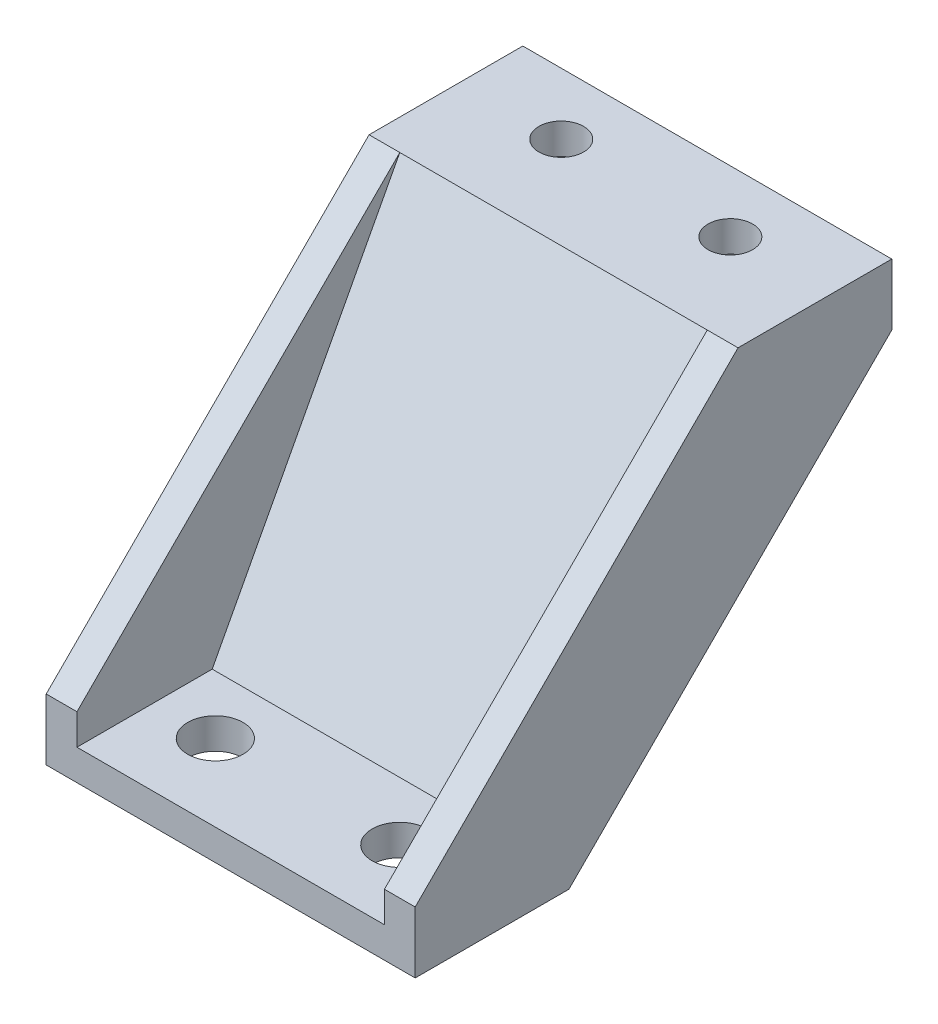
ISO-10303-21;
HEADER;
FILE_DESCRIPTION(('STEP AP214'),'2;1');
FILE_NAME('part.step','',(''),(''),'','','');
FILE_SCHEMA(('AUTOMOTIVE_DESIGN { 1 0 10303 214 1 1 1 1 }'));
ENDSEC;
DATA;
#1=APPLICATION_CONTEXT('core data for automotive mechanical design processes');
#2=APPLICATION_PROTOCOL_DEFINITION('international standard','automotive_design',2000,#1);
#3=PRODUCT_CONTEXT('',#1,'mechanical');
#4=PRODUCT('Part','Part','',(#3));
#5=PRODUCT_RELATED_PRODUCT_CATEGORY('part','',(#4));
#6=PRODUCT_DEFINITION_FORMATION('','',#4);
#7=PRODUCT_DEFINITION_CONTEXT('part definition',#1,'design');
#8=PRODUCT_DEFINITION('design','',#6,#7);
#9=PRODUCT_DEFINITION_SHAPE('','',#8);
#10=(LENGTH_UNIT() NAMED_UNIT(*) SI_UNIT(.MILLI.,.METRE.));
#11=(NAMED_UNIT(*) PLANE_ANGLE_UNIT() SI_UNIT($,.RADIAN.));
#12=(NAMED_UNIT(*) SI_UNIT($,.STERADIAN.) SOLID_ANGLE_UNIT());
#13=UNCERTAINTY_MEASURE_WITH_UNIT(LENGTH_MEASURE(1.E-05),#10,'distance_accuracy_value','');
#14=(GEOMETRIC_REPRESENTATION_CONTEXT(3) GLOBAL_UNCERTAINTY_ASSIGNED_CONTEXT((#13)) GLOBAL_UNIT_ASSIGNED_CONTEXT((#10,
#11,#12)) REPRESENTATION_CONTEXT('',''));
#15=CARTESIAN_POINT('',(0.,0.,0.));
#16=DIRECTION('',(0.,0.,1.));
#17=DIRECTION('',(1.,0.,0.));
#18=AXIS2_PLACEMENT_3D('',#15,#16,#17);
#19=CARTESIAN_POINT('',(2.,0.,0.));
#20=DIRECTION('',(1.,0.,0.));
#21=DIRECTION('',(0.,0.,-1.));
#22=AXIS2_PLACEMENT_3D('',#19,#20,#21);
#23=PLANE('',#22);
#24=DIRECTION('',(0.,0.,1.));
#25=VECTOR('',#24,1.);
#26=CARTESIAN_POINT('',(2.,2.,0.));
#27=LINE('',#26,#25);
#28=CARTESIAN_POINT('',(2.,2.,-8.79706096712944));
#29=VERTEX_POINT('',#28);
#30=CARTESIAN_POINT('',(2.,2.,0.));
#31=VERTEX_POINT('',#30);
#32=EDGE_CURVE('E51',#29,#31,#27,.T.);
#33=ORIENTED_EDGE('',*,*,#32,.F.);
#34=DIRECTION('',(0.,-0.883367189804038,0.468681563513774));
#35=VECTOR('',#34,1.);
#36=CARTESIAN_POINT('',(2.,2.,-8.79706096712944));
#37=LINE('',#36,#35);
#38=CARTESIAN_POINT('',(2.,25.,-20.9999999999999));
#39=VERTEX_POINT('',#38);
#40=EDGE_CURVE('E217',#39,#29,#37,.T.);
#41=ORIENTED_EDGE('',*,*,#40,.F.);
#42=DIRECTION('',(0.,-0.707106781186549,0.707106781186546));
#43=VECTOR('',#42,1.);
#44=CARTESIAN_POINT('',(2.,25.,-20.9999999999999));
#45=LINE('',#44,#43);
#46=CARTESIAN_POINT('',(2.,4.,0.));
#47=VERTEX_POINT('',#46);
#48=EDGE_CURVE('E240',#39,#47,#45,.T.);
#49=ORIENTED_EDGE('',*,*,#48,.T.);
#50=DIRECTION('',(0.,-1.,0.));
#51=VECTOR('',#50,1.);
#52=CARTESIAN_POINT('',(2.,4.,0.));
#53=LINE('',#52,#51);
#54=EDGE_CURVE('E233',#47,#31,#53,.T.);
#55=ORIENTED_EDGE('',*,*,#54,.T.);
#56=EDGE_LOOP('',(#33,#41,#49,#55));
#57=FACE_BOUND('',#56,.T.);
#58=ADVANCED_FACE('F35',(#57),#23,.T.);
#59=CARTESIAN_POINT('',(2.,4.,0.));
#60=DIRECTION('',(0.,0.,-1.));
#61=DIRECTION('',(0.,1.,0.));
#62=AXIS2_PLACEMENT_3D('',#59,#60,#61);
#63=PLANE('',#62);
#64=DIRECTION('',(0.,-1.,0.));
#65=VECTOR('',#64,1.);
#66=CARTESIAN_POINT('',(0.,4.,0.));
#67=LINE('',#66,#65);
#68=CARTESIAN_POINT('',(0.,4.,0.));
#69=VERTEX_POINT('',#68);
#70=CARTESIAN_POINT('',(0.,0.,0.));
#71=VERTEX_POINT('',#70);
#72=EDGE_CURVE('E232',#69,#71,#67,.T.);
#73=ORIENTED_EDGE('',*,*,#72,.T.);
#74=DIRECTION('',(-1.,0.,0.));
#75=VECTOR('',#74,1.);
#76=CARTESIAN_POINT('',(2.,0.,0.));
#77=LINE('',#76,#75);
#78=CARTESIAN_POINT('',(24.,0.,0.));
#79=VERTEX_POINT('',#78);
#80=EDGE_CURVE('E11',#79,#71,#77,.T.);
#81=ORIENTED_EDGE('',*,*,#80,.F.);
#82=DIRECTION('',(0.,-1.,0.));
#83=VECTOR('',#82,1.);
#84=CARTESIAN_POINT('',(24.,4.,0.));
#85=LINE('',#84,#83);
#86=CARTESIAN_POINT('',(24.,4.,0.));
#87=VERTEX_POINT('',#86);
#88=EDGE_CURVE('E172',#87,#79,#85,.T.);
#89=ORIENTED_EDGE('',*,*,#88,.F.);
#90=DIRECTION('',(1.,0.,0.));
#91=VECTOR('',#90,1.);
#92=CARTESIAN_POINT('',(22.,4.,0.));
#93=LINE('',#92,#91);
#94=CARTESIAN_POINT('',(22.,4.,0.));
#95=VERTEX_POINT('',#94);
#96=EDGE_CURVE('E166',#95,#87,#93,.T.);
#97=ORIENTED_EDGE('',*,*,#96,.F.);
#98=DIRECTION('',(0.,-1.,0.));
#99=VECTOR('',#98,1.);
#100=CARTESIAN_POINT('',(22.,4.,0.));
#101=LINE('',#100,#99);
#102=CARTESIAN_POINT('',(22.,2.,0.));
#103=VERTEX_POINT('',#102);
#104=EDGE_CURVE('E168',#95,#103,#101,.T.);
#105=ORIENTED_EDGE('',*,*,#104,.T.);
#106=DIRECTION('',(-1.,0.,0.));
#107=VECTOR('',#106,1.);
#108=CARTESIAN_POINT('',(12.,2.,0.));
#109=LINE('',#108,#107);
#110=EDGE_CURVE('E223',#103,#31,#109,.T.);
#111=ORIENTED_EDGE('',*,*,#110,.T.);
#112=ORIENTED_EDGE('',*,*,#54,.F.);
#113=DIRECTION('',(-1.,0.,0.));
#114=VECTOR('',#113,1.);
#115=CARTESIAN_POINT('',(2.,4.,0.));
#116=LINE('',#115,#114);
#117=EDGE_CURVE('E242',#47,#69,#116,.T.);
#118=ORIENTED_EDGE('',*,*,#117,.T.);
#119=EDGE_LOOP('',(#73,#81,#89,#97,#105,#111,#112,#118));
#120=FACE_BOUND('',#119,.T.);
#121=ADVANCED_FACE('F37',(#120),#63,.F.);
#122=CARTESIAN_POINT('',(2.,0.,0.));
#123=DIRECTION('',(0.,1.,0.));
#124=DIRECTION('',(0.,0.,1.));
#125=AXIS2_PLACEMENT_3D('',#122,#123,#124);
#126=PLANE('',#125);
#127=CARTESIAN_POINT('',(6.,0.,-5.));
#128=DIRECTION('',(0.,1.,0.));
#129=DIRECTION('',(0.,0.,1.));
#130=AXIS2_PLACEMENT_3D('',#127,#128,#129);
#131=CIRCLE('',#130,1.8);
#132=CARTESIAN_POINT('',(6.,0.,-3.2));
#133=VERTEX_POINT('',#132);
#134=EDGE_CURVE('E210',#133,#133,#131,.T.);
#135=ORIENTED_EDGE('',*,*,#134,.T.);
#136=EDGE_LOOP('',(#135));
#137=FACE_BOUND('',#136,.T.);
#138=DIRECTION('',(0.,0.,-1.));
#139=VECTOR('',#138,1.);
#140=CARTESIAN_POINT('',(0.,0.,0.));
#141=LINE('',#140,#139);
#142=CARTESIAN_POINT('',(0.,0.,-10.));
#143=VERTEX_POINT('',#142);
#144=EDGE_CURVE('E245',#71,#143,#141,.T.);
#145=ORIENTED_EDGE('',*,*,#144,.T.);
#146=DIRECTION('',(-1.,0.,0.));
#147=VECTOR('',#146,1.);
#148=CARTESIAN_POINT('',(2.,0.,-10.));
#149=LINE('',#148,#147);
#150=CARTESIAN_POINT('',(2.,0.,-10.));
#151=VERTEX_POINT('',#150);
#152=EDGE_CURVE('E44',#151,#143,#149,.T.);
#153=ORIENTED_EDGE('',*,*,#152,.F.);
#154=DIRECTION('',(-1.,0.,0.));
#155=VECTOR('',#154,1.);
#156=CARTESIAN_POINT('',(12.,0.,-10.));
#157=LINE('',#156,#155);
#158=CARTESIAN_POINT('',(22.,0.,-10.));
#159=VERTEX_POINT('',#158);
#160=EDGE_CURVE('E220',#159,#151,#157,.T.);
#161=ORIENTED_EDGE('',*,*,#160,.F.);
#162=DIRECTION('',(1.,0.,0.));
#163=VECTOR('',#162,1.);
#164=CARTESIAN_POINT('',(22.,0.,-10.));
#165=LINE('',#164,#163);
#166=CARTESIAN_POINT('',(24.,0.,-10.));
#167=VERTEX_POINT('',#166);
#168=EDGE_CURVE('E196',#159,#167,#165,.T.);
#169=ORIENTED_EDGE('',*,*,#168,.T.);
#170=DIRECTION('',(0.,0.,-1.));
#171=VECTOR('',#170,1.);
#172=CARTESIAN_POINT('',(24.,0.,0.));
#173=LINE('',#172,#171);
#174=EDGE_CURVE('E175',#79,#167,#173,.T.);
#175=ORIENTED_EDGE('',*,*,#174,.F.);
#176=ORIENTED_EDGE('',*,*,#80,.T.);
#177=EDGE_LOOP('',(#145,#153,#161,#169,#175,#176));
#178=FACE_BOUND('',#177,.T.);
#179=CARTESIAN_POINT('',(18.,0.,-5.));
#180=DIRECTION('',(0.,-1.,0.));
#181=DIRECTION('',(0.,0.,1.));
#182=AXIS2_PLACEMENT_3D('',#179,#180,#181);
#183=CIRCLE('',#182,1.8);
#184=CARTESIAN_POINT('',(18.,0.,-3.2));
#185=VERTEX_POINT('',#184);
#186=EDGE_CURVE('E317',#185,#185,#183,.T.);
#187=ORIENTED_EDGE('',*,*,#186,.F.);
#188=EDGE_LOOP('',(#187));
#189=FACE_BOUND('',#188,.T.);
#190=ADVANCED_FACE('F291',(#137,#178,#189),#126,.F.);
#191=CARTESIAN_POINT('',(2.,0.,-10.));
#192=DIRECTION('',(0.,0.707106781186546,0.707106781186549));
#193=DIRECTION('',(0.,-0.707106781186549,0.707106781186546));
#194=AXIS2_PLACEMENT_3D('',#191,#192,#193);
#195=PLANE('',#194);
#196=DIRECTION('',(0.,0.707106781186549,-0.707106781186546));
#197=VECTOR('',#196,1.);
#198=CARTESIAN_POINT('',(0.,0.,-10.));
#199=LINE('',#198,#197);
#200=CARTESIAN_POINT('',(0.,21.,-30.9999999999999));
#201=VERTEX_POINT('',#200);
#202=EDGE_CURVE('E247',#143,#201,#199,.T.);
#203=ORIENTED_EDGE('',*,*,#202,.T.);
#204=DIRECTION('',(-1.,0.,0.));
#205=VECTOR('',#204,1.);
#206=CARTESIAN_POINT('',(2.,21.,-30.9999999999999));
#207=LINE('',#206,#205);
#208=CARTESIAN_POINT('',(2.,21.,-30.9999999999999));
#209=VERTEX_POINT('',#208);
#210=EDGE_CURVE('E262',#209,#201,#207,.T.);
#211=ORIENTED_EDGE('',*,*,#210,.F.);
#212=DIRECTION('',(0.,0.707106781186549,-0.707106781186546));
#213=VECTOR('',#212,1.);
#214=CARTESIAN_POINT('',(2.,0.,-10.));
#215=LINE('',#214,#213);
#216=EDGE_CURVE('E235',#151,#209,#215,.T.);
#217=ORIENTED_EDGE('',*,*,#216,.F.);
#218=ORIENTED_EDGE('',*,*,#152,.T.);
#219=EDGE_LOOP('',(#203,#211,#217,#218));
#220=FACE_BOUND('',#219,.T.);
#221=ADVANCED_FACE('F270',(#220),#195,.F.);
#222=CARTESIAN_POINT('',(2.,21.,-30.9999999999999));
#223=DIRECTION('',(0.,0.,1.));
#224=DIRECTION('',(1.,0.,0.));
#225=AXIS2_PLACEMENT_3D('',#222,#223,#224);
#226=PLANE('',#225);
#227=DIRECTION('',(0.,1.,0.));
#228=VECTOR('',#227,1.);
#229=CARTESIAN_POINT('',(0.,21.,-30.9999999999999));
#230=LINE('',#229,#228);
#231=CARTESIAN_POINT('',(0.,25.,-30.9999999999999));
#232=VERTEX_POINT('',#231);
#233=EDGE_CURVE('E249',#201,#232,#230,.T.);
#234=ORIENTED_EDGE('',*,*,#233,.T.);
#235=DIRECTION('',(-1.,0.,0.));
#236=VECTOR('',#235,1.);
#237=CARTESIAN_POINT('',(2.,25.,-30.9999999999999));
#238=LINE('',#237,#236);
#239=CARTESIAN_POINT('',(24.,25.,-30.9999999999999));
#240=VERTEX_POINT('',#239);
#241=EDGE_CURVE('E259',#240,#232,#238,.T.);
#242=ORIENTED_EDGE('',*,*,#241,.F.);
#243=DIRECTION('',(0.,1.,0.));
#244=VECTOR('',#243,1.);
#245=CARTESIAN_POINT('',(24.,21.,-30.9999999999999));
#246=LINE('',#245,#244);
#247=CARTESIAN_POINT('',(24.,21.,-30.9999999999999));
#248=VERTEX_POINT('',#247);
#249=EDGE_CURVE('E182',#248,#240,#246,.T.);
#250=ORIENTED_EDGE('',*,*,#249,.F.);
#251=DIRECTION('',(1.,0.,0.));
#252=VECTOR('',#251,1.);
#253=CARTESIAN_POINT('',(22.,21.,-30.9999999999999));
#254=LINE('',#253,#252);
#255=CARTESIAN_POINT('',(22.,21.,-30.9999999999999));
#256=VERTEX_POINT('',#255);
#257=EDGE_CURVE('E160',#256,#248,#254,.T.);
#258=ORIENTED_EDGE('',*,*,#257,.F.);
#259=DIRECTION('',(0.,1.,0.));
#260=VECTOR('',#259,1.);
#261=CARTESIAN_POINT('',(22.,21.,-30.9999999999999));
#262=LINE('',#261,#260);
#263=CARTESIAN_POINT('',(22.,23.,-30.9999999999999));
#264=VERTEX_POINT('',#263);
#265=EDGE_CURVE('E152',#256,#264,#262,.T.);
#266=ORIENTED_EDGE('',*,*,#265,.T.);
#267=DIRECTION('',(-1.,0.,0.));
#268=VECTOR('',#267,1.);
#269=CARTESIAN_POINT('',(12.,23.,-30.9999999999999));
#270=LINE('',#269,#268);
#271=CARTESIAN_POINT('',(2.,23.,-30.9999999999999));
#272=VERTEX_POINT('',#271);
#273=EDGE_CURVE('E137',#264,#272,#270,.T.);
#274=ORIENTED_EDGE('',*,*,#273,.T.);
#275=DIRECTION('',(0.,1.,0.));
#276=VECTOR('',#275,1.);
#277=CARTESIAN_POINT('',(2.,21.,-30.9999999999999));
#278=LINE('',#277,#276);
#279=EDGE_CURVE('E238',#209,#272,#278,.T.);
#280=ORIENTED_EDGE('',*,*,#279,.F.);
#281=ORIENTED_EDGE('',*,*,#210,.T.);
#282=EDGE_LOOP('',(#234,#242,#250,#258,#266,#274,#280,#281));
#283=FACE_BOUND('',#282,.T.);
#284=ADVANCED_FACE('F158',(#283),#226,.F.);
#285=CARTESIAN_POINT('',(2.,25.,-30.9999999999999));
#286=DIRECTION('',(0.,-1.,0.));
#287=DIRECTION('',(0.,0.,-1.));
#288=AXIS2_PLACEMENT_3D('',#285,#286,#287);
#289=PLANE('',#288);
#290=CARTESIAN_POINT('',(6.5,25.,-26.9999999999999));
#291=DIRECTION('',(0.,1.,0.));
#292=DIRECTION('',(0.,0.,1.));
#293=AXIS2_PLACEMENT_3D('',#290,#291,#292);
#294=CIRCLE('',#293,1.45);
#295=CARTESIAN_POINT('',(6.5,25.,-25.5499999999999));
#296=VERTEX_POINT('',#295);
#297=EDGE_CURVE('E199',#296,#296,#294,.T.);
#298=ORIENTED_EDGE('',*,*,#297,.F.);
#299=EDGE_LOOP('',(#298));
#300=FACE_BOUND('',#299,.T.);
#301=DIRECTION('',(0.,0.,1.));
#302=VECTOR('',#301,1.);
#303=CARTESIAN_POINT('',(0.,25.,-30.9999999999999));
#304=LINE('',#303,#302);
#305=CARTESIAN_POINT('',(0.,25.,-20.9999999999999));
#306=VERTEX_POINT('',#305);
#307=EDGE_CURVE('E251',#232,#306,#304,.T.);
#308=ORIENTED_EDGE('',*,*,#307,.T.);
#309=DIRECTION('',(-1.,0.,0.));
#310=VECTOR('',#309,1.);
#311=CARTESIAN_POINT('',(2.,25.,-20.9999999999999));
#312=LINE('',#311,#310);
#313=EDGE_CURVE('E256',#39,#306,#312,.T.);
#314=ORIENTED_EDGE('',*,*,#313,.F.);
#315=DIRECTION('',(-1.,0.,0.));
#316=VECTOR('',#315,1.);
#317=CARTESIAN_POINT('',(12.,25.,-20.9999999999999));
#318=LINE('',#317,#316);
#319=CARTESIAN_POINT('',(22.,25.,-20.9999999999999));
#320=VERTEX_POINT('',#319);
#321=EDGE_CURVE('E147',#320,#39,#318,.T.);
#322=ORIENTED_EDGE('',*,*,#321,.F.);
#323=DIRECTION('',(1.,0.,0.));
#324=VECTOR('',#323,1.);
#325=CARTESIAN_POINT('',(22.,25.,-20.9999999999999));
#326=LINE('',#325,#324);
#327=CARTESIAN_POINT('',(24.,25.,-20.9999999999999));
#328=VERTEX_POINT('',#327);
#329=EDGE_CURVE('E192',#320,#328,#326,.T.);
#330=ORIENTED_EDGE('',*,*,#329,.T.);
#331=DIRECTION('',(0.,0.,1.));
#332=VECTOR('',#331,1.);
#333=CARTESIAN_POINT('',(24.,25.,-30.9999999999999));
#334=LINE('',#333,#332);
#335=EDGE_CURVE('E185',#240,#328,#334,.T.);
#336=ORIENTED_EDGE('',*,*,#335,.F.);
#337=ORIENTED_EDGE('',*,*,#241,.T.);
#338=EDGE_LOOP('',(#308,#314,#322,#330,#336,#337));
#339=FACE_BOUND('',#338,.T.);
#340=CARTESIAN_POINT('',(17.5,25.,-26.9999999999999));
#341=DIRECTION('',(0.,-1.,0.));
#342=DIRECTION('',(0.,0.,1.));
#343=AXIS2_PLACEMENT_3D('',#340,#341,#342);
#344=CIRCLE('',#343,1.45);
#345=CARTESIAN_POINT('',(17.5,25.,-25.5499999999999));
#346=VERTEX_POINT('',#345);
#347=EDGE_CURVE('E204',#346,#346,#344,.T.);
#348=ORIENTED_EDGE('',*,*,#347,.T.);
#349=EDGE_LOOP('',(#348));
#350=FACE_BOUND('',#349,.T.);
#351=ADVANCED_FACE('F281',(#300,#339,#350),#289,.F.);
#352=CARTESIAN_POINT('',(2.,25.,-20.9999999999999));
#353=DIRECTION('',(0.,-0.707106781186546,-0.707106781186549));
#354=DIRECTION('',(0.,0.707106781186549,-0.707106781186546));
#355=AXIS2_PLACEMENT_3D('',#352,#353,#354);
#356=PLANE('',#355);
#357=DIRECTION('',(0.,-0.707106781186549,0.707106781186546));
#358=VECTOR('',#357,1.);
#359=CARTESIAN_POINT('',(0.,25.,-20.9999999999999));
#360=LINE('',#359,#358);
#361=EDGE_CURVE('E236',#306,#69,#360,.T.);
#362=ORIENTED_EDGE('',*,*,#361,.T.);
#363=ORIENTED_EDGE('',*,*,#117,.F.);
#364=ORIENTED_EDGE('',*,*,#48,.F.);
#365=ORIENTED_EDGE('',*,*,#313,.T.);
#366=EDGE_LOOP('',(#362,#363,#364,#365));
#367=FACE_BOUND('',#366,.T.);
#368=ADVANCED_FACE('F299',(#367),#356,.F.);
#369=DIRECTION('',(0.,0.883367189804039,-0.468681563513774));
#370=VECTOR('',#369,1.);
#371=CARTESIAN_POINT('',(2.,23.,-22.2029390328705));
#372=LINE('',#371,#370);
#373=CARTESIAN_POINT('',(2.,23.,-22.2029390328705));
#374=VERTEX_POINT('',#373);
#375=EDGE_CURVE('E213',#151,#374,#372,.T.);
#376=ORIENTED_EDGE('',*,*,#375,.F.);
#377=ORIENTED_EDGE('',*,*,#216,.T.);
#378=ORIENTED_EDGE('',*,*,#279,.T.);
#379=DIRECTION('',(0.,0.,-1.));
#380=VECTOR('',#379,1.);
#381=CARTESIAN_POINT('',(2.,23.,-30.9999999999999));
#382=LINE('',#381,#380);
#383=EDGE_CURVE('E59',#374,#272,#382,.T.);
#384=ORIENTED_EDGE('',*,*,#383,.F.);
#385=EDGE_LOOP('',(#376,#377,#378,#384));
#386=FACE_BOUND('',#385,.T.);
#387=ADVANCED_FACE('F346',(#386),#23,.T.);
#388=CARTESIAN_POINT('',(0.,0.,0.));
#389=DIRECTION('',(1.,0.,0.));
#390=DIRECTION('',(0.,0.,-1.));
#391=AXIS2_PLACEMENT_3D('',#388,#389,#390);
#392=PLANE('',#391);
#393=ORIENTED_EDGE('',*,*,#72,.F.);
#394=ORIENTED_EDGE('',*,*,#361,.F.);
#395=ORIENTED_EDGE('',*,*,#307,.F.);
#396=ORIENTED_EDGE('',*,*,#233,.F.);
#397=ORIENTED_EDGE('',*,*,#202,.F.);
#398=ORIENTED_EDGE('',*,*,#144,.F.);
#399=EDGE_LOOP('',(#393,#394,#395,#396,#397,#398));
#400=FACE_BOUND('',#399,.T.);
#401=ADVANCED_FACE('F276',(#400),#392,.F.);
#402=CARTESIAN_POINT('',(12.,23.,-22.2029390328705));
#403=DIRECTION('',(0.,0.468681563513774,0.883367189804039));
#404=DIRECTION('',(0.,-0.883367189804039,0.468681563513774));
#405=AXIS2_PLACEMENT_3D('',#402,#403,#404);
#406=PLANE('',#405);
#407=ORIENTED_EDGE('',*,*,#375,.T.);
#408=DIRECTION('',(-1.,0.,0.));
#409=VECTOR('',#408,1.);
#410=CARTESIAN_POINT('',(12.,23.,-22.2029390328705));
#411=LINE('',#410,#409);
#412=CARTESIAN_POINT('',(22.,23.,-22.2029390328705));
#413=VERTEX_POINT('',#412);
#414=EDGE_CURVE('E146',#413,#374,#411,.T.);
#415=ORIENTED_EDGE('',*,*,#414,.F.);
#416=DIRECTION('',(0.,0.883367189804039,-0.468681563513774));
#417=VECTOR('',#416,1.);
#418=CARTESIAN_POINT('',(22.,23.,-22.2029390328705));
#419=LINE('',#418,#417);
#420=EDGE_CURVE('E155',#159,#413,#419,.T.);
#421=ORIENTED_EDGE('',*,*,#420,.F.);
#422=ORIENTED_EDGE('',*,*,#160,.T.);
#423=EDGE_LOOP('',(#407,#415,#421,#422));
#424=FACE_BOUND('',#423,.T.);
#425=ADVANCED_FACE('F332',(#424),#406,.F.);
#426=CARTESIAN_POINT('',(12.,23.,-30.9999999999999));
#427=DIRECTION('',(0.,1.,0.));
#428=DIRECTION('',(0.,0.,1.));
#429=AXIS2_PLACEMENT_3D('',#426,#427,#428);
#430=PLANE('',#429);
#431=CARTESIAN_POINT('',(6.5,23.,-26.9999999999999));
#432=DIRECTION('',(0.,1.,0.));
#433=DIRECTION('',(0.,0.,1.));
#434=AXIS2_PLACEMENT_3D('',#431,#432,#433);
#435=CIRCLE('',#434,1.45);
#436=CARTESIAN_POINT('',(6.5,23.,-25.5499999999999));
#437=VERTEX_POINT('',#436);
#438=EDGE_CURVE('E39',#437,#437,#435,.T.);
#439=ORIENTED_EDGE('',*,*,#438,.T.);
#440=EDGE_LOOP('',(#439));
#441=FACE_BOUND('',#440,.T.);
#442=ORIENTED_EDGE('',*,*,#383,.T.);
#443=ORIENTED_EDGE('',*,*,#273,.F.);
#444=DIRECTION('',(0.,0.,-1.));
#445=VECTOR('',#444,1.);
#446=CARTESIAN_POINT('',(22.,23.,-30.9999999999999));
#447=LINE('',#446,#445);
#448=EDGE_CURVE('E141',#413,#264,#447,.T.);
#449=ORIENTED_EDGE('',*,*,#448,.F.);
#450=ORIENTED_EDGE('',*,*,#414,.T.);
#451=EDGE_LOOP('',(#442,#443,#449,#450));
#452=FACE_BOUND('',#451,.T.);
#453=CARTESIAN_POINT('',(17.5,23.,-26.9999999999999));
#454=DIRECTION('',(0.,-1.,0.));
#455=DIRECTION('',(0.,0.,1.));
#456=AXIS2_PLACEMENT_3D('',#453,#454,#455);
#457=CIRCLE('',#456,1.45);
#458=CARTESIAN_POINT('',(17.5,23.,-25.5499999999999));
#459=VERTEX_POINT('',#458);
#460=EDGE_CURVE('E200',#459,#459,#457,.T.);
#461=ORIENTED_EDGE('',*,*,#460,.F.);
#462=EDGE_LOOP('',(#461));
#463=FACE_BOUND('',#462,.T.);
#464=ADVANCED_FACE('F139',(#441,#452,#463),#430,.F.);
#465=CARTESIAN_POINT('',(12.,2.,-8.79706096712944));
#466=DIRECTION('',(0.,-0.468681563513774,-0.883367189804038));
#467=DIRECTION('',(0.,0.883367189804039,-0.468681563513774));
#468=AXIS2_PLACEMENT_3D('',#465,#466,#467);
#469=PLANE('',#468);
#470=ORIENTED_EDGE('',*,*,#40,.T.);
#471=DIRECTION('',(-1.,0.,0.));
#472=VECTOR('',#471,1.);
#473=CARTESIAN_POINT('',(12.,2.,-8.79706096712944));
#474=LINE('',#473,#472);
#475=CARTESIAN_POINT('',(22.,2.,-8.79706096712944));
#476=VERTEX_POINT('',#475);
#477=EDGE_CURVE('E226',#476,#29,#474,.T.);
#478=ORIENTED_EDGE('',*,*,#477,.F.);
#479=DIRECTION('',(0.,-0.883367189804038,0.468681563513774));
#480=VECTOR('',#479,1.);
#481=CARTESIAN_POINT('',(22.,2.,-8.79706096712944));
#482=LINE('',#481,#480);
#483=EDGE_CURVE('E156',#320,#476,#482,.T.);
#484=ORIENTED_EDGE('',*,*,#483,.F.);
#485=ORIENTED_EDGE('',*,*,#321,.T.);
#486=EDGE_LOOP('',(#470,#478,#484,#485));
#487=FACE_BOUND('',#486,.T.);
#488=ADVANCED_FACE('F308',(#487),#469,.F.);
#489=CARTESIAN_POINT('',(12.,2.,0.));
#490=DIRECTION('',(0.,-1.,0.));
#491=DIRECTION('',(0.,0.,-1.));
#492=AXIS2_PLACEMENT_3D('',#489,#490,#491);
#493=PLANE('',#492);
#494=CARTESIAN_POINT('',(6.,2.,-5.));
#495=DIRECTION('',(0.,1.,0.));
#496=DIRECTION('',(0.,0.,1.));
#497=AXIS2_PLACEMENT_3D('',#494,#495,#496);
#498=CIRCLE('',#497,1.8);
#499=CARTESIAN_POINT('',(6.,2.,-3.2));
#500=VERTEX_POINT('',#499);
#501=EDGE_CURVE('E207',#500,#500,#498,.T.);
#502=ORIENTED_EDGE('',*,*,#501,.F.);
#503=EDGE_LOOP('',(#502));
#504=FACE_BOUND('',#503,.T.);
#505=ORIENTED_EDGE('',*,*,#32,.T.);
#506=ORIENTED_EDGE('',*,*,#110,.F.);
#507=DIRECTION('',(0.,0.,1.));
#508=VECTOR('',#507,1.);
#509=CARTESIAN_POINT('',(22.,2.,0.));
#510=LINE('',#509,#508);
#511=EDGE_CURVE('E176',#476,#103,#510,.T.);
#512=ORIENTED_EDGE('',*,*,#511,.F.);
#513=ORIENTED_EDGE('',*,*,#477,.T.);
#514=EDGE_LOOP('',(#505,#506,#512,#513));
#515=FACE_BOUND('',#514,.T.);
#516=CARTESIAN_POINT('',(18.,2.,-5.));
#517=DIRECTION('',(0.,-1.,0.));
#518=DIRECTION('',(0.,0.,1.));
#519=AXIS2_PLACEMENT_3D('',#516,#517,#518);
#520=CIRCLE('',#519,1.8);
#521=CARTESIAN_POINT('',(18.,2.,-3.2));
#522=VERTEX_POINT('',#521);
#523=EDGE_CURVE('E203',#522,#522,#520,.T.);
#524=ORIENTED_EDGE('',*,*,#523,.T.);
#525=EDGE_LOOP('',(#524));
#526=FACE_BOUND('',#525,.T.);
#527=ADVANCED_FACE('F339',(#504,#515,#526),#493,.F.);
#528=CARTESIAN_POINT('',(6.,2.,-5.));
#529=DIRECTION('',(0.,1.,0.));
#530=DIRECTION('',(0.,0.,1.));
#531=AXIS2_PLACEMENT_3D('',#528,#529,#530);
#532=CYLINDRICAL_SURFACE('',#531,1.8);
#533=ORIENTED_EDGE('',*,*,#134,.F.);
#534=EDGE_LOOP('',(#533));
#535=FACE_BOUND('',#534,.T.);
#536=ORIENTED_EDGE('',*,*,#501,.T.);
#537=EDGE_LOOP('',(#536));
#538=FACE_BOUND('',#537,.T.);
#539=ADVANCED_FACE('F372',(#535,#538),#532,.F.);
#540=CARTESIAN_POINT('',(6.5,25.,-26.9999999999999));
#541=DIRECTION('',(0.,1.,0.));
#542=DIRECTION('',(0.,0.,1.));
#543=AXIS2_PLACEMENT_3D('',#540,#541,#542);
#544=CYLINDRICAL_SURFACE('',#543,1.45);
#545=ORIENTED_EDGE('',*,*,#297,.T.);
#546=EDGE_LOOP('',(#545));
#547=FACE_BOUND('',#546,.T.);
#548=ORIENTED_EDGE('',*,*,#438,.F.);
#549=EDGE_LOOP('',(#548));
#550=FACE_BOUND('',#549,.T.);
#551=ADVANCED_FACE('F375',(#547,#550),#544,.F.);
#552=CARTESIAN_POINT('',(22.,0.,0.));
#553=DIRECTION('',(-1.,0.,0.));
#554=DIRECTION('',(0.,0.,-1.));
#555=AXIS2_PLACEMENT_3D('',#552,#553,#554);
#556=PLANE('',#555);
#557=ORIENTED_EDGE('',*,*,#511,.T.);
#558=ORIENTED_EDGE('',*,*,#104,.F.);
#559=DIRECTION('',(0.,-0.707106781186549,0.707106781186546));
#560=VECTOR('',#559,1.);
#561=CARTESIAN_POINT('',(22.,25.,-20.9999999999999));
#562=LINE('',#561,#560);
#563=EDGE_CURVE('E162',#320,#95,#562,.T.);
#564=ORIENTED_EDGE('',*,*,#563,.F.);
#565=ORIENTED_EDGE('',*,*,#483,.T.);
#566=EDGE_LOOP('',(#557,#558,#564,#565));
#567=FACE_BOUND('',#566,.T.);
#568=ADVANCED_FACE('F313',(#567),#556,.T.);
#569=CARTESIAN_POINT('',(22.,0.,-10.));
#570=DIRECTION('',(0.,0.707106781186546,0.707106781186549));
#571=DIRECTION('',(0.,-0.707106781186549,0.707106781186546));
#572=AXIS2_PLACEMENT_3D('',#569,#570,#571);
#573=PLANE('',#572);
#574=DIRECTION('',(0.,0.707106781186549,-0.707106781186546));
#575=VECTOR('',#574,1.);
#576=CARTESIAN_POINT('',(24.,0.,-10.));
#577=LINE('',#576,#575);
#578=EDGE_CURVE('E179',#167,#248,#577,.T.);
#579=ORIENTED_EDGE('',*,*,#578,.F.);
#580=ORIENTED_EDGE('',*,*,#168,.F.);
#581=DIRECTION('',(0.,0.707106781186549,-0.707106781186546));
#582=VECTOR('',#581,1.);
#583=CARTESIAN_POINT('',(22.,0.,-10.));
#584=LINE('',#583,#582);
#585=EDGE_CURVE('E163',#159,#256,#584,.T.);
#586=ORIENTED_EDGE('',*,*,#585,.T.);
#587=ORIENTED_EDGE('',*,*,#257,.T.);
#588=EDGE_LOOP('',(#579,#580,#586,#587));
#589=FACE_BOUND('',#588,.T.);
#590=ADVANCED_FACE('F288',(#589),#573,.F.);
#591=CARTESIAN_POINT('',(22.,25.,-20.9999999999999));
#592=DIRECTION('',(0.,-0.707106781186546,-0.707106781186549));
#593=DIRECTION('',(0.,0.707106781186549,-0.707106781186546));
#594=AXIS2_PLACEMENT_3D('',#591,#592,#593);
#595=PLANE('',#594);
#596=DIRECTION('',(0.,-0.707106781186549,0.707106781186546));
#597=VECTOR('',#596,1.);
#598=CARTESIAN_POINT('',(24.,25.,-20.9999999999999));
#599=LINE('',#598,#597);
#600=EDGE_CURVE('E188',#328,#87,#599,.T.);
#601=ORIENTED_EDGE('',*,*,#600,.F.);
#602=ORIENTED_EDGE('',*,*,#329,.F.);
#603=ORIENTED_EDGE('',*,*,#563,.T.);
#604=ORIENTED_EDGE('',*,*,#96,.T.);
#605=EDGE_LOOP('',(#601,#602,#603,#604));
#606=FACE_BOUND('',#605,.T.);
#607=ADVANCED_FACE('F304',(#606),#595,.F.);
#608=ORIENTED_EDGE('',*,*,#420,.T.);
#609=ORIENTED_EDGE('',*,*,#448,.T.);
#610=ORIENTED_EDGE('',*,*,#265,.F.);
#611=ORIENTED_EDGE('',*,*,#585,.F.);
#612=EDGE_LOOP('',(#608,#609,#610,#611));
#613=FACE_BOUND('',#612,.T.);
#614=ADVANCED_FACE('F150',(#613),#556,.T.);
#615=CARTESIAN_POINT('',(24.,0.,0.));
#616=DIRECTION('',(-1.,0.,0.));
#617=DIRECTION('',(0.,0.,-1.));
#618=AXIS2_PLACEMENT_3D('',#615,#616,#617);
#619=PLANE('',#618);
#620=ORIENTED_EDGE('',*,*,#88,.T.);
#621=ORIENTED_EDGE('',*,*,#174,.T.);
#622=ORIENTED_EDGE('',*,*,#578,.T.);
#623=ORIENTED_EDGE('',*,*,#249,.T.);
#624=ORIENTED_EDGE('',*,*,#335,.T.);
#625=ORIENTED_EDGE('',*,*,#600,.T.);
#626=EDGE_LOOP('',(#620,#621,#622,#623,#624,#625));
#627=FACE_BOUND('',#626,.T.);
#628=ADVANCED_FACE('F286',(#627),#619,.F.);
#629=CARTESIAN_POINT('',(18.,2.,-5.));
#630=DIRECTION('',(0.,1.,0.));
#631=DIRECTION('',(0.,0.,1.));
#632=AXIS2_PLACEMENT_3D('',#629,#630,#631);
#633=CYLINDRICAL_SURFACE('',#632,1.8);
#634=ORIENTED_EDGE('',*,*,#186,.T.);
#635=EDGE_LOOP('',(#634));
#636=FACE_BOUND('',#635,.T.);
#637=ORIENTED_EDGE('',*,*,#523,.F.);
#638=EDGE_LOOP('',(#637));
#639=FACE_BOUND('',#638,.T.);
#640=ADVANCED_FACE('F328',(#636,#639),#633,.F.);
#641=CARTESIAN_POINT('',(17.5,25.,-26.9999999999999));
#642=DIRECTION('',(0.,1.,0.));
#643=DIRECTION('',(0.,0.,1.));
#644=AXIS2_PLACEMENT_3D('',#641,#642,#643);
#645=CYLINDRICAL_SURFACE('',#644,1.45);
#646=ORIENTED_EDGE('',*,*,#347,.F.);
#647=EDGE_LOOP('',(#646));
#648=FACE_BOUND('',#647,.T.);
#649=ORIENTED_EDGE('',*,*,#460,.T.);
#650=EDGE_LOOP('',(#649));
#651=FACE_BOUND('',#650,.T.);
#652=ADVANCED_FACE('F325',(#648,#651),#645,.F.);
#653=CLOSED_SHELL('',(#58,#121,#190,#221,#284,#351,#368,#387,#401,#425,#464,#488,#527,#539,#551,
#568,#590,#607,#614,#628,#640,#652));
#654=MANIFOLD_SOLID_BREP('B2',#653);
#655=ADVANCED_BREP_SHAPE_REPRESENTATION('',(#18,#654),#14);
#656=SHAPE_DEFINITION_REPRESENTATION(#9,#655);
ENDSEC;
END-ISO-10303-21;
